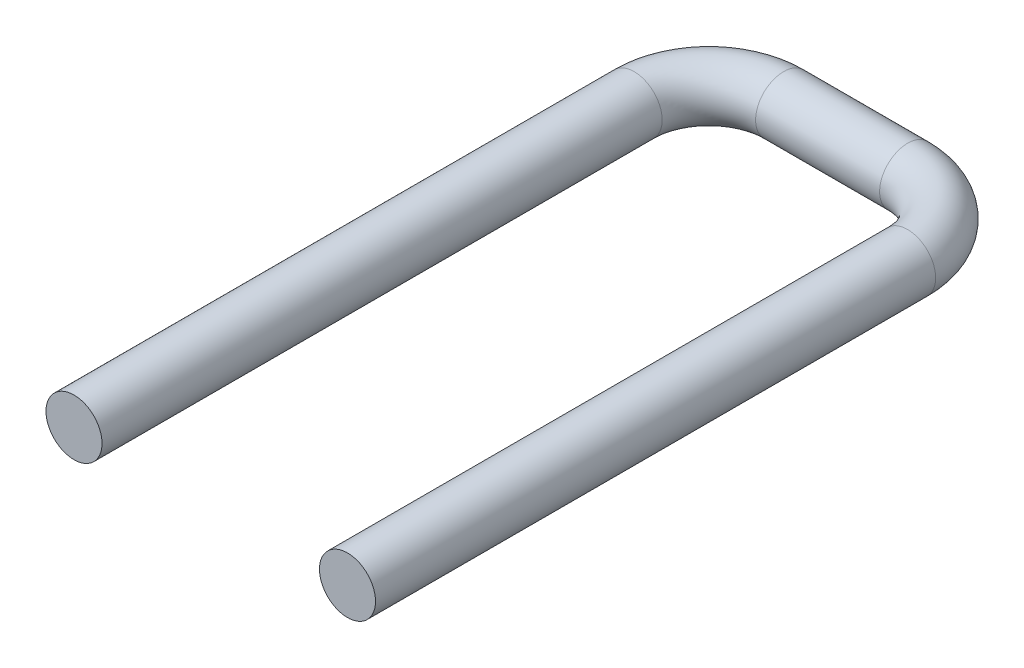
ISO-10303-21;
HEADER;
FILE_DESCRIPTION(('STEP AP214'),'2;1');
FILE_NAME('part.step','',(''),(''),'','','');
FILE_SCHEMA(('AUTOMOTIVE_DESIGN { 1 0 10303 214 1 1 1 1 }'));
ENDSEC;
DATA;
#1=APPLICATION_CONTEXT('core data for automotive mechanical design processes');
#2=APPLICATION_PROTOCOL_DEFINITION('international standard','automotive_design',2000,#1);
#3=PRODUCT_CONTEXT('',#1,'mechanical');
#4=PRODUCT('Part','Part','',(#3));
#5=PRODUCT_RELATED_PRODUCT_CATEGORY('part','',(#4));
#6=PRODUCT_DEFINITION_FORMATION('','',#4);
#7=PRODUCT_DEFINITION_CONTEXT('part definition',#1,'design');
#8=PRODUCT_DEFINITION('design','',#6,#7);
#9=PRODUCT_DEFINITION_SHAPE('','',#8);
#10=(LENGTH_UNIT() NAMED_UNIT(*) SI_UNIT(.MILLI.,.METRE.));
#11=(NAMED_UNIT(*) PLANE_ANGLE_UNIT() SI_UNIT($,.RADIAN.));
#12=(NAMED_UNIT(*) SI_UNIT($,.STERADIAN.) SOLID_ANGLE_UNIT());
#13=UNCERTAINTY_MEASURE_WITH_UNIT(LENGTH_MEASURE(1.E-05),#10,'distance_accuracy_value','');
#14=(GEOMETRIC_REPRESENTATION_CONTEXT(3) GLOBAL_UNCERTAINTY_ASSIGNED_CONTEXT((#13)) GLOBAL_UNIT_ASSIGNED_CONTEXT((#10,
#11,#12)) REPRESENTATION_CONTEXT('',''));
#15=CARTESIAN_POINT('',(0.,0.,0.));
#16=DIRECTION('',(0.,0.,1.));
#17=DIRECTION('',(1.,0.,0.));
#18=AXIS2_PLACEMENT_3D('',#15,#16,#17);
#19=CARTESIAN_POINT('',(4.39832794698266,0.,-15.31971545));
#20=DIRECTION('',(0.,0.,1.));
#21=DIRECTION('',(1.,0.,0.));
#22=AXIS2_PLACEMENT_3D('',#19,#20,#21);
#23=CYLINDRICAL_SURFACE('',#22,0.75);
#24=CARTESIAN_POINT('',(4.39832794698266,0.,-15.31971545));
#25=DIRECTION('',(0.,0.,1.));
#26=DIRECTION('',(1.,0.,0.));
#27=AXIS2_PLACEMENT_3D('',#24,#25,#26);
#28=CIRCLE('',#27,0.75);
#29=CARTESIAN_POINT('',(5.14832794698266,0.,-15.31971545));
#30=VERTEX_POINT('',#29);
#31=EDGE_CURVE('E34',#30,#30,#28,.T.);
#32=ORIENTED_EDGE('',*,*,#31,.T.);
#33=EDGE_LOOP('',(#32));
#34=FACE_BOUND('',#33,.T.);
#35=CARTESIAN_POINT('',(4.39832794698266,0.,-0.326690485083058));
#36=DIRECTION('',(0.,0.,1.));
#37=DIRECTION('',(1.,0.,0.));
#38=AXIS2_PLACEMENT_3D('',#35,#36,#37);
#39=CIRCLE('',#38,0.75);
#40=CARTESIAN_POINT('',(5.14832794698266,0.,-0.326690485083048));
#41=VERTEX_POINT('',#40);
#42=EDGE_CURVE('E10',#41,#41,#39,.T.);
#43=ORIENTED_EDGE('',*,*,#42,.F.);
#44=EDGE_LOOP('',(#43));
#45=FACE_BOUND('',#44,.T.);
#46=ADVANCED_FACE('F28',(#34,#45),#23,.T.);
#47=CARTESIAN_POINT('',(2.39832794698266,0.,-15.31971545));
#48=DIRECTION('',(0.,-1.,0.));
#49=DIRECTION('',(0.,0.,-1.));
#50=AXIS2_PLACEMENT_3D('',#47,#48,#49);
#51=TOROIDAL_SURFACE('',#50,2.,0.75);
#52=CARTESIAN_POINT('',(2.39832794698266,0.,-17.31971545));
#53=DIRECTION('',(1.,0.,0.));
#54=DIRECTION('',(0.,0.,-1.));
#55=AXIS2_PLACEMENT_3D('',#52,#53,#54);
#56=CIRCLE('',#55,0.75);
#57=CARTESIAN_POINT('',(2.39832794698266,0.,-18.06971545));
#58=VERTEX_POINT('',#57);
#59=EDGE_CURVE('E38',#58,#58,#56,.T.);
#60=CARTESIAN_POINT('',(2.39832794698266,0.,-15.31971545));
#61=DIRECTION('',(0.,-1.,0.));
#62=DIRECTION('',(0.,0.,-1.));
#63=AXIS2_PLACEMENT_3D('',#60,#61,#62);
#64=CIRCLE('',#63,2.75);
#65=EDGE_CURVE('',#58,#30,#64,.T.);
#66=ORIENTED_EDGE('',*,*,#59,.T.);
#67=ORIENTED_EDGE('',*,*,#31,.F.);
#68=ORIENTED_EDGE('',*,*,#65,.T.);
#69=ORIENTED_EDGE('',*,*,#65,.F.);
#70=EDGE_LOOP('',(#66,#68,#67,#69));
#71=FACE_BOUND('',#70,.T.);
#72=ADVANCED_FACE('F72',(#71),#51,.T.);
#73=CARTESIAN_POINT('',(-0.921672053017325,0.,-17.31971545));
#74=DIRECTION('',(1.,0.,0.));
#75=DIRECTION('',(0.,0.,-1.));
#76=AXIS2_PLACEMENT_3D('',#73,#74,#75);
#77=CYLINDRICAL_SURFACE('',#76,0.75);
#78=CARTESIAN_POINT('',(-0.921672053017325,0.,-17.31971545));
#79=DIRECTION('',(1.,0.,0.));
#80=DIRECTION('',(0.,0.,-1.));
#81=AXIS2_PLACEMENT_3D('',#78,#79,#80);
#82=CIRCLE('',#81,0.75);
#83=CARTESIAN_POINT('',(-0.921672053017321,0.,-18.06971545));
#84=VERTEX_POINT('',#83);
#85=EDGE_CURVE('E42',#84,#84,#82,.T.);
#86=ORIENTED_EDGE('',*,*,#85,.T.);
#87=EDGE_LOOP('',(#86));
#88=FACE_BOUND('',#87,.T.);
#89=ORIENTED_EDGE('',*,*,#59,.F.);
#90=EDGE_LOOP('',(#89));
#91=FACE_BOUND('',#90,.T.);
#92=ADVANCED_FACE('F76',(#88,#91),#77,.T.);
#93=CARTESIAN_POINT('',(-0.921672053017337,0.,-15.31971545));
#94=DIRECTION('',(0.,-1.,0.));
#95=DIRECTION('',(0.,0.,-1.));
#96=AXIS2_PLACEMENT_3D('',#93,#94,#95);
#97=TOROIDAL_SURFACE('',#96,2.,0.75);
#98=CARTESIAN_POINT('',(-2.92167205301734,0.,-15.31971545));
#99=DIRECTION('',(0.,0.,-1.));
#100=DIRECTION('',(-1.,0.,0.));
#101=AXIS2_PLACEMENT_3D('',#98,#99,#100);
#102=CIRCLE('',#101,0.75);
#103=CARTESIAN_POINT('',(-3.67167205301734,0.,-15.31971545));
#104=VERTEX_POINT('',#103);
#105=EDGE_CURVE('E47',#104,#104,#102,.T.);
#106=CARTESIAN_POINT('',(-0.921672053017337,0.,-15.31971545));
#107=DIRECTION('',(0.,-1.,0.));
#108=DIRECTION('',(0.,0.,-1.));
#109=AXIS2_PLACEMENT_3D('',#106,#107,#108);
#110=CIRCLE('',#109,2.75);
#111=EDGE_CURVE('',#104,#84,#110,.T.);
#112=ORIENTED_EDGE('',*,*,#105,.T.);
#113=ORIENTED_EDGE('',*,*,#85,.F.);
#114=ORIENTED_EDGE('',*,*,#111,.T.);
#115=ORIENTED_EDGE('',*,*,#111,.F.);
#116=EDGE_LOOP('',(#112,#114,#113,#115));
#117=FACE_BOUND('',#116,.T.);
#118=ADVANCED_FACE('F54',(#117),#97,.T.);
#119=CARTESIAN_POINT('',(-2.92167205301734,0.,-15.31971545));
#120=DIRECTION('',(0.,0.,1.));
#121=DIRECTION('',(1.,0.,0.));
#122=AXIS2_PLACEMENT_3D('',#119,#120,#121);
#123=CYLINDRICAL_SURFACE('',#122,0.75);
#124=ORIENTED_EDGE('',*,*,#105,.F.);
#125=EDGE_LOOP('',(#124));
#126=FACE_BOUND('',#125,.T.);
#127=CARTESIAN_POINT('',(-2.92167205301734,0.,-0.326690485083056));
#128=DIRECTION('',(0.,0.,-1.));
#129=DIRECTION('',(-1.,0.,0.));
#130=AXIS2_PLACEMENT_3D('',#127,#128,#129);
#131=CIRCLE('',#130,0.75);
#132=CARTESIAN_POINT('',(-3.67167205301734,0.,-0.326690485083056));
#133=VERTEX_POINT('',#132);
#134=EDGE_CURVE('E48',#133,#133,#131,.T.);
#135=ORIENTED_EDGE('',*,*,#134,.T.);
#136=EDGE_LOOP('',(#135));
#137=FACE_BOUND('',#136,.T.);
#138=ADVANCED_FACE('F57',(#126,#137),#123,.T.);
#139=CARTESIAN_POINT('',(4.39832794698266,0.,-0.326690485083058));
#140=DIRECTION('',(0.,0.,1.));
#141=DIRECTION('',(1.,0.,0.));
#142=AXIS2_PLACEMENT_3D('',#139,#140,#141);
#143=PLANE('',#142);
#144=ORIENTED_EDGE('',*,*,#42,.T.);
#145=EDGE_LOOP('',(#144));
#146=FACE_BOUND('',#145,.T.);
#147=ADVANCED_FACE('F60',(#146),#143,.T.);
#148=CARTESIAN_POINT('',(-2.92167205301734,0.,-0.326690485083056));
#149=DIRECTION('',(0.,0.,-1.));
#150=DIRECTION('',(-1.,0.,0.));
#151=AXIS2_PLACEMENT_3D('',#148,#149,#150);
#152=PLANE('',#151);
#153=ORIENTED_EDGE('',*,*,#134,.F.);
#154=EDGE_LOOP('',(#153));
#155=FACE_BOUND('',#154,.T.);
#156=ADVANCED_FACE('F64',(#155),#152,.F.);
#157=CLOSED_SHELL('',(#46,#72,#92,#118,#138,#147,#156));
#158=MANIFOLD_SOLID_BREP('B2',#157);
#159=ADVANCED_BREP_SHAPE_REPRESENTATION('',(#18,#158),#14);
#160=SHAPE_DEFINITION_REPRESENTATION(#9,#159);
ENDSEC;
END-ISO-10303-21;
